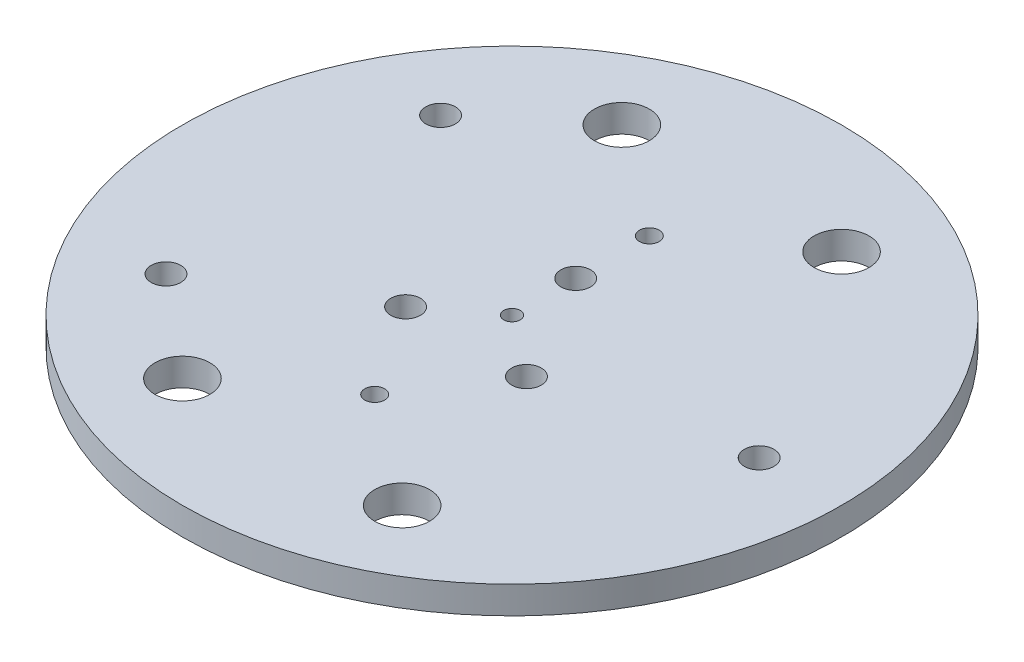
ISO-10303-21;
HEADER;
FILE_DESCRIPTION(('STEP AP214'),'2;1');
FILE_NAME('part.step','',(''),(''),'','','');
FILE_SCHEMA(('AUTOMOTIVE_DESIGN { 1 0 10303 214 1 1 1 1 }'));
ENDSEC;
DATA;
#1=APPLICATION_CONTEXT('core data for automotive mechanical design processes');
#2=APPLICATION_PROTOCOL_DEFINITION('international standard','automotive_design',2000,#1);
#3=PRODUCT_CONTEXT('',#1,'mechanical');
#4=PRODUCT('Part','Part','',(#3));
#5=PRODUCT_RELATED_PRODUCT_CATEGORY('part','',(#4));
#6=PRODUCT_DEFINITION_FORMATION('','',#4);
#7=PRODUCT_DEFINITION_CONTEXT('part definition',#1,'design');
#8=PRODUCT_DEFINITION('design','',#6,#7);
#9=PRODUCT_DEFINITION_SHAPE('','',#8);
#10=(LENGTH_UNIT() NAMED_UNIT(*) SI_UNIT(.MILLI.,.METRE.));
#11=(NAMED_UNIT(*) PLANE_ANGLE_UNIT() SI_UNIT($,.RADIAN.));
#12=(NAMED_UNIT(*) SI_UNIT($,.STERADIAN.) SOLID_ANGLE_UNIT());
#13=UNCERTAINTY_MEASURE_WITH_UNIT(LENGTH_MEASURE(1.E-05),#10,'distance_accuracy_value','');
#14=(GEOMETRIC_REPRESENTATION_CONTEXT(3) GLOBAL_UNCERTAINTY_ASSIGNED_CONTEXT((#13)) GLOBAL_UNIT_ASSIGNED_CONTEXT((#10,
#11,#12)) REPRESENTATION_CONTEXT('',''));
#15=CARTESIAN_POINT('',(0.,0.,0.));
#16=DIRECTION('',(0.,0.,1.));
#17=DIRECTION('',(1.,0.,0.));
#18=AXIS2_PLACEMENT_3D('',#15,#16,#17);
#19=CARTESIAN_POINT('',(0.,6.35,0.));
#20=DIRECTION('',(0.,-1.,0.));
#21=DIRECTION('',(0.,0.,-1.));
#22=AXIS2_PLACEMENT_3D('',#19,#20,#21);
#23=CYLINDRICAL_SURFACE('',#22,76.2);
#24=CARTESIAN_POINT('',(0.,6.35,0.));
#25=DIRECTION('',(0.,1.,0.));
#26=DIRECTION('',(0.,0.,1.));
#27=AXIS2_PLACEMENT_3D('',#24,#25,#26);
#28=CIRCLE('',#27,76.2);
#29=CARTESIAN_POINT('',(0.,6.35,76.2));
#30=VERTEX_POINT('',#29);
#31=EDGE_CURVE('E10',#30,#30,#28,.T.);
#32=ORIENTED_EDGE('',*,*,#31,.F.);
#33=EDGE_LOOP('',(#32));
#34=FACE_BOUND('',#33,.T.);
#35=CARTESIAN_POINT('',(0.,0.,0.));
#36=DIRECTION('',(0.,1.,0.));
#37=DIRECTION('',(0.,0.,1.));
#38=AXIS2_PLACEMENT_3D('',#35,#36,#37);
#39=CIRCLE('',#38,76.2);
#40=CARTESIAN_POINT('',(0.,0.,76.2));
#41=VERTEX_POINT('',#40);
#42=EDGE_CURVE('E36',#41,#41,#39,.T.);
#43=ORIENTED_EDGE('',*,*,#42,.T.);
#44=EDGE_LOOP('',(#43));
#45=FACE_BOUND('',#44,.T.);
#46=ADVANCED_FACE('F33',(#34,#45),#23,.T.);
#47=CARTESIAN_POINT('',(0.,6.35,0.));
#48=DIRECTION('',(0.,1.,0.));
#49=DIRECTION('',(0.,0.,1.));
#50=AXIS2_PLACEMENT_3D('',#47,#48,#49);
#51=PLANE('',#50);
#52=CARTESIAN_POINT('',(0.,6.35,-31.75));
#53=DIRECTION('',(0.,1.,0.));
#54=DIRECTION('',(0.,0.,1.));
#55=AXIS2_PLACEMENT_3D('',#52,#53,#54);
#56=CIRCLE('',#55,2.286);
#57=CARTESIAN_POINT('',(0.,6.35,-29.464));
#58=VERTEX_POINT('',#57);
#59=EDGE_CURVE('E117',#58,#58,#56,.T.);
#60=ORIENTED_EDGE('',*,*,#59,.F.);
#61=EDGE_LOOP('',(#60));
#62=FACE_BOUND('',#61,.T.);
#63=CARTESIAN_POINT('',(0.,6.35,31.75));
#64=DIRECTION('',(0.,1.,0.));
#65=DIRECTION('',(0.,0.,1.));
#66=AXIS2_PLACEMENT_3D('',#63,#64,#65);
#67=CIRCLE('',#66,2.286);
#68=CARTESIAN_POINT('',(0.,6.35,34.036));
#69=VERTEX_POINT('',#68);
#70=EDGE_CURVE('E111',#69,#69,#67,.T.);
#71=ORIENTED_EDGE('',*,*,#70,.F.);
#72=EDGE_LOOP('',(#71));
#73=FACE_BOUND('',#72,.T.);
#74=CARTESIAN_POINT('',(-48.26,6.35,31.75));
#75=DIRECTION('',(0.,1.,0.));
#76=DIRECTION('',(0.,0.,1.));
#77=AXIS2_PLACEMENT_3D('',#74,#75,#76);
#78=CIRCLE('',#77,3.429);
#79=CARTESIAN_POINT('',(-48.26,6.35,35.179));
#80=VERTEX_POINT('',#79);
#81=EDGE_CURVE('E105',#80,#80,#78,.T.);
#82=ORIENTED_EDGE('',*,*,#81,.F.);
#83=EDGE_LOOP('',(#82));
#84=FACE_BOUND('',#83,.T.);
#85=CARTESIAN_POINT('',(-48.26,6.35,-31.75));
#86=DIRECTION('',(0.,1.,0.));
#87=DIRECTION('',(0.,0.,1.));
#88=AXIS2_PLACEMENT_3D('',#85,#86,#87);
#89=CIRCLE('',#88,3.429);
#90=CARTESIAN_POINT('',(-48.26,6.35,-28.321));
#91=VERTEX_POINT('',#90);
#92=EDGE_CURVE('E99',#91,#91,#89,.T.);
#93=ORIENTED_EDGE('',*,*,#92,.F.);
#94=EDGE_LOOP('',(#93));
#95=FACE_BOUND('',#94,.T.);
#96=CARTESIAN_POINT('',(57.15,6.35,0.));
#97=DIRECTION('',(0.,1.,0.));
#98=DIRECTION('',(0.,0.,1.));
#99=AXIS2_PLACEMENT_3D('',#96,#97,#98);
#100=CIRCLE('',#99,3.429);
#101=CARTESIAN_POINT('',(57.15,6.35,3.429));
#102=VERTEX_POINT('',#101);
#103=EDGE_CURVE('E93',#102,#102,#100,.T.);
#104=ORIENTED_EDGE('',*,*,#103,.F.);
#105=EDGE_LOOP('',(#104));
#106=FACE_BOUND('',#105,.T.);
#107=CARTESIAN_POINT('',(25.4,6.35,-50.8));
#108=DIRECTION('',(0.,1.,0.));
#109=DIRECTION('',(0.,0.,1.));
#110=AXIS2_PLACEMENT_3D('',#107,#108,#109);
#111=CIRCLE('',#110,6.35);
#112=CARTESIAN_POINT('',(25.4,6.35,-44.45));
#113=VERTEX_POINT('',#112);
#114=EDGE_CURVE('E87',#113,#113,#111,.T.);
#115=ORIENTED_EDGE('',*,*,#114,.F.);
#116=EDGE_LOOP('',(#115));
#117=FACE_BOUND('',#116,.T.);
#118=CARTESIAN_POINT('',(-25.4,6.35,-50.8));
#119=DIRECTION('',(0.,1.,0.));
#120=DIRECTION('',(0.,0.,1.));
#121=AXIS2_PLACEMENT_3D('',#118,#119,#120);
#122=CIRCLE('',#121,6.35);
#123=CARTESIAN_POINT('',(-25.4,6.35,-44.45));
#124=VERTEX_POINT('',#123);
#125=EDGE_CURVE('E81',#124,#124,#122,.T.);
#126=ORIENTED_EDGE('',*,*,#125,.F.);
#127=EDGE_LOOP('',(#126));
#128=FACE_BOUND('',#127,.T.);
#129=CARTESIAN_POINT('',(25.4,6.35,50.8));
#130=DIRECTION('',(0.,1.,0.));
#131=DIRECTION('',(0.,0.,1.));
#132=AXIS2_PLACEMENT_3D('',#129,#130,#131);
#133=CIRCLE('',#132,6.35);
#134=CARTESIAN_POINT('',(25.4,6.35,57.15));
#135=VERTEX_POINT('',#134);
#136=EDGE_CURVE('E75',#135,#135,#133,.T.);
#137=ORIENTED_EDGE('',*,*,#136,.F.);
#138=EDGE_LOOP('',(#137));
#139=FACE_BOUND('',#138,.T.);
#140=CARTESIAN_POINT('',(-25.4,6.35,50.8));
#141=DIRECTION('',(0.,1.,0.));
#142=DIRECTION('',(0.,0.,1.));
#143=AXIS2_PLACEMENT_3D('',#140,#141,#142);
#144=CIRCLE('',#143,6.35);
#145=CARTESIAN_POINT('',(-25.4,6.35,57.15));
#146=VERTEX_POINT('',#145);
#147=EDGE_CURVE('E69',#146,#146,#144,.T.);
#148=ORIENTED_EDGE('',*,*,#147,.F.);
#149=EDGE_LOOP('',(#148));
#150=FACE_BOUND('',#149,.T.);
#151=CARTESIAN_POINT('',(13.97,6.35,10.6311432594621));
#152=DIRECTION('',(0.,1.,0.));
#153=DIRECTION('',(0.,0.,1.));
#154=AXIS2_PLACEMENT_3D('',#151,#152,#153);
#155=CIRCLE('',#154,3.429);
#156=CARTESIAN_POINT('',(13.97,6.35,14.0601432594621));
#157=VERTEX_POINT('',#156);
#158=EDGE_CURVE('E63',#157,#157,#155,.T.);
#159=ORIENTED_EDGE('',*,*,#158,.F.);
#160=EDGE_LOOP('',(#159));
#161=FACE_BOUND('',#160,.T.);
#162=CARTESIAN_POINT('',(-13.97,6.35,10.6311432594621));
#163=DIRECTION('',(0.,1.,0.));
#164=DIRECTION('',(0.,0.,1.));
#165=AXIS2_PLACEMENT_3D('',#162,#163,#164);
#166=CIRCLE('',#165,3.429);
#167=CARTESIAN_POINT('',(-13.97,6.35,14.0601432594621));
#168=VERTEX_POINT('',#167);
#169=EDGE_CURVE('E57',#168,#168,#166,.T.);
#170=ORIENTED_EDGE('',*,*,#169,.F.);
#171=EDGE_LOOP('',(#170));
#172=FACE_BOUND('',#171,.T.);
#173=CARTESIAN_POINT('',(0.,6.35,-14.732));
#174=DIRECTION('',(0.,1.,0.));
#175=DIRECTION('',(0.,0.,1.));
#176=AXIS2_PLACEMENT_3D('',#173,#174,#175);
#177=CIRCLE('',#176,3.429);
#178=CARTESIAN_POINT('',(0.,6.35,-11.303));
#179=VERTEX_POINT('',#178);
#180=EDGE_CURVE('E51',#179,#179,#177,.T.);
#181=ORIENTED_EDGE('',*,*,#180,.F.);
#182=EDGE_LOOP('',(#181));
#183=FACE_BOUND('',#182,.T.);
#184=CARTESIAN_POINT('',(0.,6.35,0.));
#185=DIRECTION('',(0.,1.,0.));
#186=DIRECTION('',(0.,0.,1.));
#187=AXIS2_PLACEMENT_3D('',#184,#185,#186);
#188=CIRCLE('',#187,1.905);
#189=CARTESIAN_POINT('',(0.,6.35,1.905));
#190=VERTEX_POINT('',#189);
#191=EDGE_CURVE('E45',#190,#190,#188,.T.);
#192=ORIENTED_EDGE('',*,*,#191,.F.);
#193=EDGE_LOOP('',(#192));
#194=FACE_BOUND('',#193,.T.);
#195=ORIENTED_EDGE('',*,*,#31,.T.);
#196=EDGE_LOOP('',(#195));
#197=FACE_BOUND('',#196,.T.);
#198=ADVANCED_FACE('F133',(#62,#73,#84,#95,#106,#117,#128,#139,#150,#161,#172,#183,#194,#197),
#51,.T.);
#199=CARTESIAN_POINT('',(0.,0.,0.));
#200=DIRECTION('',(0.,1.,0.));
#201=DIRECTION('',(0.,0.,1.));
#202=AXIS2_PLACEMENT_3D('',#199,#200,#201);
#203=PLANE('',#202);
#204=CARTESIAN_POINT('',(0.,0.,-31.75));
#205=DIRECTION('',(0.,1.,0.));
#206=DIRECTION('',(0.,0.,1.));
#207=AXIS2_PLACEMENT_3D('',#204,#205,#206);
#208=CIRCLE('',#207,2.286);
#209=CARTESIAN_POINT('',(0.,0.,-29.464));
#210=VERTEX_POINT('',#209);
#211=EDGE_CURVE('E114',#210,#210,#208,.T.);
#212=ORIENTED_EDGE('',*,*,#211,.T.);
#213=EDGE_LOOP('',(#212));
#214=FACE_BOUND('',#213,.T.);
#215=CARTESIAN_POINT('',(0.,0.,31.75));
#216=DIRECTION('',(0.,1.,0.));
#217=DIRECTION('',(0.,0.,1.));
#218=AXIS2_PLACEMENT_3D('',#215,#216,#217);
#219=CIRCLE('',#218,2.286);
#220=CARTESIAN_POINT('',(0.,0.,34.036));
#221=VERTEX_POINT('',#220);
#222=EDGE_CURVE('E108',#221,#221,#219,.T.);
#223=ORIENTED_EDGE('',*,*,#222,.T.);
#224=EDGE_LOOP('',(#223));
#225=FACE_BOUND('',#224,.T.);
#226=CARTESIAN_POINT('',(-48.26,0.,31.75));
#227=DIRECTION('',(0.,1.,0.));
#228=DIRECTION('',(0.,0.,1.));
#229=AXIS2_PLACEMENT_3D('',#226,#227,#228);
#230=CIRCLE('',#229,3.429);
#231=CARTESIAN_POINT('',(-48.26,0.,35.179));
#232=VERTEX_POINT('',#231);
#233=EDGE_CURVE('E102',#232,#232,#230,.T.);
#234=ORIENTED_EDGE('',*,*,#233,.T.);
#235=EDGE_LOOP('',(#234));
#236=FACE_BOUND('',#235,.T.);
#237=CARTESIAN_POINT('',(-48.26,0.,-31.75));
#238=DIRECTION('',(0.,1.,0.));
#239=DIRECTION('',(0.,0.,1.));
#240=AXIS2_PLACEMENT_3D('',#237,#238,#239);
#241=CIRCLE('',#240,3.429);
#242=CARTESIAN_POINT('',(-48.26,0.,-28.321));
#243=VERTEX_POINT('',#242);
#244=EDGE_CURVE('E96',#243,#243,#241,.T.);
#245=ORIENTED_EDGE('',*,*,#244,.T.);
#246=EDGE_LOOP('',(#245));
#247=FACE_BOUND('',#246,.T.);
#248=CARTESIAN_POINT('',(57.15,0.,0.));
#249=DIRECTION('',(0.,1.,0.));
#250=DIRECTION('',(0.,0.,1.));
#251=AXIS2_PLACEMENT_3D('',#248,#249,#250);
#252=CIRCLE('',#251,3.429);
#253=CARTESIAN_POINT('',(57.15,0.,3.429));
#254=VERTEX_POINT('',#253);
#255=EDGE_CURVE('E90',#254,#254,#252,.T.);
#256=ORIENTED_EDGE('',*,*,#255,.T.);
#257=EDGE_LOOP('',(#256));
#258=FACE_BOUND('',#257,.T.);
#259=CARTESIAN_POINT('',(25.4,0.,-50.8));
#260=DIRECTION('',(0.,1.,0.));
#261=DIRECTION('',(0.,0.,1.));
#262=AXIS2_PLACEMENT_3D('',#259,#260,#261);
#263=CIRCLE('',#262,6.35);
#264=CARTESIAN_POINT('',(25.4,0.,-44.45));
#265=VERTEX_POINT('',#264);
#266=EDGE_CURVE('E84',#265,#265,#263,.T.);
#267=ORIENTED_EDGE('',*,*,#266,.T.);
#268=EDGE_LOOP('',(#267));
#269=FACE_BOUND('',#268,.T.);
#270=CARTESIAN_POINT('',(-25.4,0.,-50.8));
#271=DIRECTION('',(0.,1.,0.));
#272=DIRECTION('',(0.,0.,1.));
#273=AXIS2_PLACEMENT_3D('',#270,#271,#272);
#274=CIRCLE('',#273,6.35);
#275=CARTESIAN_POINT('',(-25.4,0.,-44.45));
#276=VERTEX_POINT('',#275);
#277=EDGE_CURVE('E78',#276,#276,#274,.T.);
#278=ORIENTED_EDGE('',*,*,#277,.T.);
#279=EDGE_LOOP('',(#278));
#280=FACE_BOUND('',#279,.T.);
#281=CARTESIAN_POINT('',(25.4,0.,50.8));
#282=DIRECTION('',(0.,1.,0.));
#283=DIRECTION('',(0.,0.,1.));
#284=AXIS2_PLACEMENT_3D('',#281,#282,#283);
#285=CIRCLE('',#284,6.35);
#286=CARTESIAN_POINT('',(25.4,0.,57.15));
#287=VERTEX_POINT('',#286);
#288=EDGE_CURVE('E72',#287,#287,#285,.T.);
#289=ORIENTED_EDGE('',*,*,#288,.T.);
#290=EDGE_LOOP('',(#289));
#291=FACE_BOUND('',#290,.T.);
#292=CARTESIAN_POINT('',(-25.4,0.,50.8));
#293=DIRECTION('',(0.,1.,0.));
#294=DIRECTION('',(0.,0.,1.));
#295=AXIS2_PLACEMENT_3D('',#292,#293,#294);
#296=CIRCLE('',#295,6.35);
#297=CARTESIAN_POINT('',(-25.4,0.,57.15));
#298=VERTEX_POINT('',#297);
#299=EDGE_CURVE('E66',#298,#298,#296,.T.);
#300=ORIENTED_EDGE('',*,*,#299,.T.);
#301=EDGE_LOOP('',(#300));
#302=FACE_BOUND('',#301,.T.);
#303=CARTESIAN_POINT('',(13.97,0.,10.6311432594621));
#304=DIRECTION('',(0.,1.,0.));
#305=DIRECTION('',(0.,0.,1.));
#306=AXIS2_PLACEMENT_3D('',#303,#304,#305);
#307=CIRCLE('',#306,3.429);
#308=CARTESIAN_POINT('',(13.97,0.,14.0601432594621));
#309=VERTEX_POINT('',#308);
#310=EDGE_CURVE('E60',#309,#309,#307,.T.);
#311=ORIENTED_EDGE('',*,*,#310,.T.);
#312=EDGE_LOOP('',(#311));
#313=FACE_BOUND('',#312,.T.);
#314=CARTESIAN_POINT('',(-13.97,0.,10.6311432594621));
#315=DIRECTION('',(0.,1.,0.));
#316=DIRECTION('',(0.,0.,1.));
#317=AXIS2_PLACEMENT_3D('',#314,#315,#316);
#318=CIRCLE('',#317,3.429);
#319=CARTESIAN_POINT('',(-13.97,0.,14.0601432594621));
#320=VERTEX_POINT('',#319);
#321=EDGE_CURVE('E54',#320,#320,#318,.T.);
#322=ORIENTED_EDGE('',*,*,#321,.T.);
#323=EDGE_LOOP('',(#322));
#324=FACE_BOUND('',#323,.T.);
#325=CARTESIAN_POINT('',(0.,0.,-14.732));
#326=DIRECTION('',(0.,1.,0.));
#327=DIRECTION('',(0.,0.,1.));
#328=AXIS2_PLACEMENT_3D('',#325,#326,#327);
#329=CIRCLE('',#328,3.429);
#330=CARTESIAN_POINT('',(0.,0.,-11.303));
#331=VERTEX_POINT('',#330);
#332=EDGE_CURVE('E48',#331,#331,#329,.T.);
#333=ORIENTED_EDGE('',*,*,#332,.T.);
#334=EDGE_LOOP('',(#333));
#335=FACE_BOUND('',#334,.T.);
#336=CARTESIAN_POINT('',(0.,0.,0.));
#337=DIRECTION('',(0.,1.,0.));
#338=DIRECTION('',(0.,0.,1.));
#339=AXIS2_PLACEMENT_3D('',#336,#337,#338);
#340=CIRCLE('',#339,1.905);
#341=CARTESIAN_POINT('',(0.,0.,1.905));
#342=VERTEX_POINT('',#341);
#343=EDGE_CURVE('E43',#342,#342,#340,.T.);
#344=ORIENTED_EDGE('',*,*,#343,.T.);
#345=EDGE_LOOP('',(#344));
#346=FACE_BOUND('',#345,.T.);
#347=ORIENTED_EDGE('',*,*,#42,.F.);
#348=EDGE_LOOP('',(#347));
#349=FACE_BOUND('',#348,.T.);
#350=ADVANCED_FACE('F123',(#214,#225,#236,#247,#258,#269,#280,#291,#302,#313,#324,#335,#346,
#349),#203,.F.);
#351=CARTESIAN_POINT('',(0.,0.,0.));
#352=DIRECTION('',(0.,1.,0.));
#353=DIRECTION('',(0.,0.,1.));
#354=AXIS2_PLACEMENT_3D('',#351,#352,#353);
#355=CYLINDRICAL_SURFACE('',#354,1.905);
#356=ORIENTED_EDGE('',*,*,#343,.F.);
#357=EDGE_LOOP('',(#356));
#358=FACE_BOUND('',#357,.T.);
#359=ORIENTED_EDGE('',*,*,#191,.T.);
#360=EDGE_LOOP('',(#359));
#361=FACE_BOUND('',#360,.T.);
#362=ADVANCED_FACE('F161',(#358,#361),#355,.F.);
#363=CARTESIAN_POINT('',(0.,0.,-14.732));
#364=DIRECTION('',(0.,1.,0.));
#365=DIRECTION('',(0.,0.,1.));
#366=AXIS2_PLACEMENT_3D('',#363,#364,#365);
#367=CYLINDRICAL_SURFACE('',#366,3.429);
#368=ORIENTED_EDGE('',*,*,#332,.F.);
#369=EDGE_LOOP('',(#368));
#370=FACE_BOUND('',#369,.T.);
#371=ORIENTED_EDGE('',*,*,#180,.T.);
#372=EDGE_LOOP('',(#371));
#373=FACE_BOUND('',#372,.T.);
#374=ADVANCED_FACE('F163',(#370,#373),#367,.F.);
#375=CARTESIAN_POINT('',(-13.97,0.,10.6311432594621));
#376=DIRECTION('',(0.,1.,0.));
#377=DIRECTION('',(0.,0.,1.));
#378=AXIS2_PLACEMENT_3D('',#375,#376,#377);
#379=CYLINDRICAL_SURFACE('',#378,3.429);
#380=ORIENTED_EDGE('',*,*,#321,.F.);
#381=EDGE_LOOP('',(#380));
#382=FACE_BOUND('',#381,.T.);
#383=ORIENTED_EDGE('',*,*,#169,.T.);
#384=EDGE_LOOP('',(#383));
#385=FACE_BOUND('',#384,.T.);
#386=ADVANCED_FACE('F170',(#382,#385),#379,.F.);
#387=CARTESIAN_POINT('',(13.97,0.,10.6311432594621));
#388=DIRECTION('',(0.,1.,0.));
#389=DIRECTION('',(0.,0.,1.));
#390=AXIS2_PLACEMENT_3D('',#387,#388,#389);
#391=CYLINDRICAL_SURFACE('',#390,3.429);
#392=ORIENTED_EDGE('',*,*,#310,.F.);
#393=EDGE_LOOP('',(#392));
#394=FACE_BOUND('',#393,.T.);
#395=ORIENTED_EDGE('',*,*,#158,.T.);
#396=EDGE_LOOP('',(#395));
#397=FACE_BOUND('',#396,.T.);
#398=ADVANCED_FACE('F262',(#394,#397),#391,.F.);
#399=CARTESIAN_POINT('',(-25.4,0.,50.8));
#400=DIRECTION('',(0.,1.,0.));
#401=DIRECTION('',(0.,0.,1.));
#402=AXIS2_PLACEMENT_3D('',#399,#400,#401);
#403=CYLINDRICAL_SURFACE('',#402,6.35);
#404=ORIENTED_EDGE('',*,*,#299,.F.);
#405=EDGE_LOOP('',(#404));
#406=FACE_BOUND('',#405,.T.);
#407=ORIENTED_EDGE('',*,*,#147,.T.);
#408=EDGE_LOOP('',(#407));
#409=FACE_BOUND('',#408,.T.);
#410=ADVANCED_FACE('F254',(#406,#409),#403,.F.);
#411=CARTESIAN_POINT('',(25.4,0.,50.8));
#412=DIRECTION('',(0.,1.,0.));
#413=DIRECTION('',(0.,0.,1.));
#414=AXIS2_PLACEMENT_3D('',#411,#412,#413);
#415=CYLINDRICAL_SURFACE('',#414,6.35);
#416=ORIENTED_EDGE('',*,*,#288,.F.);
#417=EDGE_LOOP('',(#416));
#418=FACE_BOUND('',#417,.T.);
#419=ORIENTED_EDGE('',*,*,#136,.T.);
#420=EDGE_LOOP('',(#419));
#421=FACE_BOUND('',#420,.T.);
#422=ADVANCED_FACE('F246',(#418,#421),#415,.F.);
#423=CARTESIAN_POINT('',(-25.4,0.,-50.8));
#424=DIRECTION('',(0.,1.,0.));
#425=DIRECTION('',(0.,0.,1.));
#426=AXIS2_PLACEMENT_3D('',#423,#424,#425);
#427=CYLINDRICAL_SURFACE('',#426,6.35);
#428=ORIENTED_EDGE('',*,*,#277,.F.);
#429=EDGE_LOOP('',(#428));
#430=FACE_BOUND('',#429,.T.);
#431=ORIENTED_EDGE('',*,*,#125,.T.);
#432=EDGE_LOOP('',(#431));
#433=FACE_BOUND('',#432,.T.);
#434=ADVANCED_FACE('F238',(#430,#433),#427,.F.);
#435=CARTESIAN_POINT('',(25.4,0.,-50.8));
#436=DIRECTION('',(0.,1.,0.));
#437=DIRECTION('',(0.,0.,1.));
#438=AXIS2_PLACEMENT_3D('',#435,#436,#437);
#439=CYLINDRICAL_SURFACE('',#438,6.35);
#440=ORIENTED_EDGE('',*,*,#266,.F.);
#441=EDGE_LOOP('',(#440));
#442=FACE_BOUND('',#441,.T.);
#443=ORIENTED_EDGE('',*,*,#114,.T.);
#444=EDGE_LOOP('',(#443));
#445=FACE_BOUND('',#444,.T.);
#446=ADVANCED_FACE('F230',(#442,#445),#439,.F.);
#447=CARTESIAN_POINT('',(57.15,0.,0.));
#448=DIRECTION('',(0.,1.,0.));
#449=DIRECTION('',(0.,0.,1.));
#450=AXIS2_PLACEMENT_3D('',#447,#448,#449);
#451=CYLINDRICAL_SURFACE('',#450,3.429);
#452=ORIENTED_EDGE('',*,*,#255,.F.);
#453=EDGE_LOOP('',(#452));
#454=FACE_BOUND('',#453,.T.);
#455=ORIENTED_EDGE('',*,*,#103,.T.);
#456=EDGE_LOOP('',(#455));
#457=FACE_BOUND('',#456,.T.);
#458=ADVANCED_FACE('F222',(#454,#457),#451,.F.);
#459=CARTESIAN_POINT('',(-48.26,0.,-31.75));
#460=DIRECTION('',(0.,1.,0.));
#461=DIRECTION('',(0.,0.,1.));
#462=AXIS2_PLACEMENT_3D('',#459,#460,#461);
#463=CYLINDRICAL_SURFACE('',#462,3.429);
#464=ORIENTED_EDGE('',*,*,#244,.F.);
#465=EDGE_LOOP('',(#464));
#466=FACE_BOUND('',#465,.T.);
#467=ORIENTED_EDGE('',*,*,#92,.T.);
#468=EDGE_LOOP('',(#467));
#469=FACE_BOUND('',#468,.T.);
#470=ADVANCED_FACE('F214',(#466,#469),#463,.F.);
#471=CARTESIAN_POINT('',(-48.26,0.,31.75));
#472=DIRECTION('',(0.,1.,0.));
#473=DIRECTION('',(0.,0.,1.));
#474=AXIS2_PLACEMENT_3D('',#471,#472,#473);
#475=CYLINDRICAL_SURFACE('',#474,3.429);
#476=ORIENTED_EDGE('',*,*,#233,.F.);
#477=EDGE_LOOP('',(#476));
#478=FACE_BOUND('',#477,.T.);
#479=ORIENTED_EDGE('',*,*,#81,.T.);
#480=EDGE_LOOP('',(#479));
#481=FACE_BOUND('',#480,.T.);
#482=ADVANCED_FACE('F200',(#478,#481),#475,.F.);
#483=CARTESIAN_POINT('',(0.,0.,31.75));
#484=DIRECTION('',(0.,1.,0.));
#485=DIRECTION('',(0.,0.,1.));
#486=AXIS2_PLACEMENT_3D('',#483,#484,#485);
#487=CYLINDRICAL_SURFACE('',#486,2.286);
#488=ORIENTED_EDGE('',*,*,#222,.F.);
#489=EDGE_LOOP('',(#488));
#490=FACE_BOUND('',#489,.T.);
#491=ORIENTED_EDGE('',*,*,#70,.T.);
#492=EDGE_LOOP('',(#491));
#493=FACE_BOUND('',#492,.T.);
#494=ADVANCED_FACE('F129',(#490,#493),#487,.F.);
#495=CARTESIAN_POINT('',(0.,0.,-31.75));
#496=DIRECTION('',(0.,1.,0.));
#497=DIRECTION('',(0.,0.,1.));
#498=AXIS2_PLACEMENT_3D('',#495,#496,#497);
#499=CYLINDRICAL_SURFACE('',#498,2.286);
#500=ORIENTED_EDGE('',*,*,#211,.F.);
#501=EDGE_LOOP('',(#500));
#502=FACE_BOUND('',#501,.T.);
#503=ORIENTED_EDGE('',*,*,#59,.T.);
#504=EDGE_LOOP('',(#503));
#505=FACE_BOUND('',#504,.T.);
#506=ADVANCED_FACE('F126',(#502,#505),#499,.F.);
#507=CLOSED_SHELL('',(#46,#198,#350,#362,#374,#386,#398,#410,#422,#434,#446,#458,#470,#482,#494,#506));
#508=MANIFOLD_SOLID_BREP('B2',#507);
#509=ADVANCED_BREP_SHAPE_REPRESENTATION('',(#18,#508),#14);
#510=SHAPE_DEFINITION_REPRESENTATION(#9,#509);
ENDSEC;
END-ISO-10303-21;
